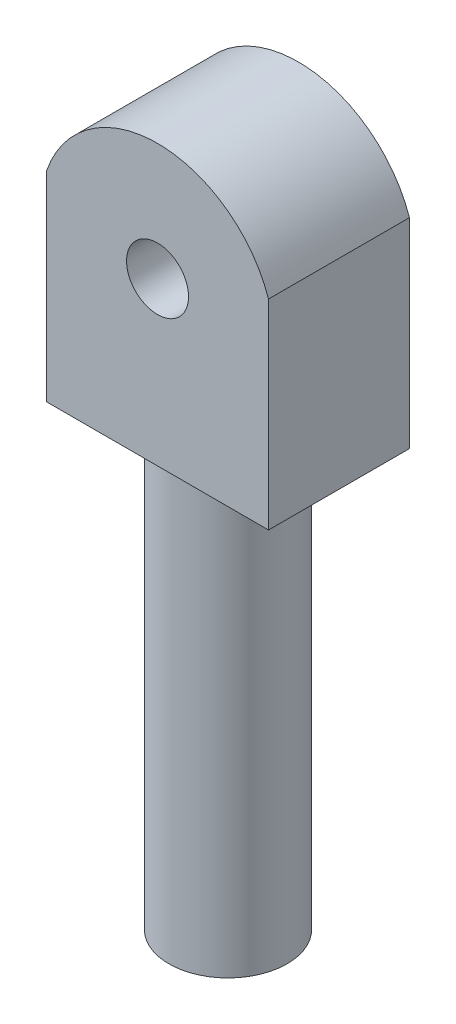
ISO-10303-21;
HEADER;
FILE_DESCRIPTION(('STEP AP214'),'2;1');
FILE_NAME('part.step','',(''),(''),'','','');
FILE_SCHEMA(('AUTOMOTIVE_DESIGN { 1 0 10303 214 1 1 1 1 }'));
ENDSEC;
DATA;
#1=APPLICATION_CONTEXT('core data for automotive mechanical design processes');
#2=APPLICATION_PROTOCOL_DEFINITION('international standard','automotive_design',2000,#1);
#3=PRODUCT_CONTEXT('',#1,'mechanical');
#4=PRODUCT('Part','Part','',(#3));
#5=PRODUCT_RELATED_PRODUCT_CATEGORY('part','',(#4));
#6=PRODUCT_DEFINITION_FORMATION('','',#4);
#7=PRODUCT_DEFINITION_CONTEXT('part definition',#1,'design');
#8=PRODUCT_DEFINITION('design','',#6,#7);
#9=PRODUCT_DEFINITION_SHAPE('','',#8);
#10=(LENGTH_UNIT() NAMED_UNIT(*) SI_UNIT(.MILLI.,.METRE.));
#11=(NAMED_UNIT(*) PLANE_ANGLE_UNIT() SI_UNIT($,.RADIAN.));
#12=(NAMED_UNIT(*) SI_UNIT($,.STERADIAN.) SOLID_ANGLE_UNIT());
#13=UNCERTAINTY_MEASURE_WITH_UNIT(LENGTH_MEASURE(1.E-05),#10,'distance_accuracy_value','');
#14=(GEOMETRIC_REPRESENTATION_CONTEXT(3) GLOBAL_UNCERTAINTY_ASSIGNED_CONTEXT((#13)) GLOBAL_UNIT_ASSIGNED_CONTEXT((#10,
#11,#12)) REPRESENTATION_CONTEXT('',''));
#15=CARTESIAN_POINT('',(0.,0.,0.));
#16=DIRECTION('',(0.,0.,1.));
#17=DIRECTION('',(1.,0.,0.));
#18=AXIS2_PLACEMENT_3D('',#15,#16,#17);
#19=CARTESIAN_POINT('',(0.,-21.59,5.08));
#20=DIRECTION('',(0.,1.,0.));
#21=DIRECTION('',(0.,0.,1.));
#22=AXIS2_PLACEMENT_3D('',#19,#20,#21);
#23=PLANE('',#22);
#24=CARTESIAN_POINT('',(0.,-21.59,2.54));
#25=DIRECTION('',(0.,-1.,0.));
#26=DIRECTION('',(0.,0.,-1.));
#27=AXIS2_PLACEMENT_3D('',#24,#25,#26);
#28=CIRCLE('',#27,1.0922);
#29=CARTESIAN_POINT('',(0.,-21.59,1.4478));
#30=VERTEX_POINT('',#29);
#31=EDGE_CURVE('E102',#30,#30,#28,.T.);
#32=ORIENTED_EDGE('',*,*,#31,.F.);
#33=EDGE_LOOP('',(#32));
#34=FACE_BOUND('',#33,.T.);
#35=CARTESIAN_POINT('',(0.,-21.59,2.54));
#36=DIRECTION('',(0.,-1.,0.));
#37=DIRECTION('',(0.,0.,-1.));
#38=AXIS2_PLACEMENT_3D('',#35,#36,#37);
#39=CIRCLE('',#38,2.13178571428581);
#40=CARTESIAN_POINT('',(0.,-21.59,0.408214285714195));
#41=VERTEX_POINT('',#40);
#42=EDGE_CURVE('E108',#41,#41,#39,.T.);
#43=ORIENTED_EDGE('',*,*,#42,.T.);
#44=EDGE_LOOP('',(#43));
#45=FACE_BOUND('',#44,.T.);
#46=ADVANCED_FACE('F35',(#34,#45),#23,.F.);
#47=CARTESIAN_POINT('',(0.,-5.842,2.54));
#48=DIRECTION('',(0.,-1.,0.));
#49=DIRECTION('',(0.,0.,-1.));
#50=AXIS2_PLACEMENT_3D('',#47,#48,#49);
#51=CYLINDRICAL_SURFACE('',#50,1.0922);
#52=CARTESIAN_POINT('',(0.,-5.842,2.54));
#53=DIRECTION('',(0.,-1.,0.));
#54=DIRECTION('',(0.,0.,-1.));
#55=AXIS2_PLACEMENT_3D('',#52,#53,#54);
#56=CIRCLE('',#55,1.0922);
#57=CARTESIAN_POINT('',(0.,-5.842,1.4478));
#58=VERTEX_POINT('',#57);
#59=EDGE_CURVE('E95',#58,#58,#56,.T.);
#60=ORIENTED_EDGE('',*,*,#59,.F.);
#61=EDGE_LOOP('',(#60));
#62=FACE_BOUND('',#61,.T.);
#63=ORIENTED_EDGE('',*,*,#31,.T.);
#64=EDGE_LOOP('',(#63));
#65=FACE_BOUND('',#64,.T.);
#66=ADVANCED_FACE('F136',(#62,#65),#51,.F.);
#67=CARTESIAN_POINT('',(0.,-5.842,2.54));
#68=DIRECTION('',(0.,-1.,0.));
#69=DIRECTION('',(0.,0.,-1.));
#70=AXIS2_PLACEMENT_3D('',#67,#68,#69);
#71=PLANE('',#70);
#72=ORIENTED_EDGE('',*,*,#59,.T.);
#73=EDGE_LOOP('',(#72));
#74=FACE_BOUND('',#73,.T.);
#75=ADVANCED_FACE('F133',(#74),#71,.T.);
#76=CARTESIAN_POINT('',(0.,-5.842,2.54));
#77=DIRECTION('',(0.,-1.,0.));
#78=DIRECTION('',(0.,0.,-1.));
#79=AXIS2_PLACEMENT_3D('',#76,#77,#78);
#80=CYLINDRICAL_SURFACE('',#79,2.13178571428581);
#81=CARTESIAN_POINT('',(0.,-5.842,2.54));
#82=DIRECTION('',(0.,-1.,0.));
#83=DIRECTION('',(0.,0.,-1.));
#84=AXIS2_PLACEMENT_3D('',#81,#82,#83);
#85=CIRCLE('',#84,2.13178571428581);
#86=CARTESIAN_POINT('',(0.,-5.842,0.408214285714195));
#87=VERTEX_POINT('',#86);
#88=EDGE_CURVE('E111',#87,#87,#85,.T.);
#89=ORIENTED_EDGE('',*,*,#88,.T.);
#90=EDGE_LOOP('',(#89));
#91=FACE_BOUND('',#90,.T.);
#92=ORIENTED_EDGE('',*,*,#42,.F.);
#93=EDGE_LOOP('',(#92));
#94=FACE_BOUND('',#93,.T.);
#95=ADVANCED_FACE('F121',(#91,#94),#80,.T.);
#96=CARTESIAN_POINT('',(0.,-5.842,0.));
#97=DIRECTION('',(0.,-1.,0.));
#98=DIRECTION('',(0.,0.,-1.));
#99=AXIS2_PLACEMENT_3D('',#96,#97,#98);
#100=PLANE('',#99);
#101=ORIENTED_EDGE('',*,*,#88,.F.);
#102=EDGE_LOOP('',(#101));
#103=FACE_BOUND('',#102,.T.);
#104=DIRECTION('',(0.,0.,-1.));
#105=VECTOR('',#104,1.);
#106=CARTESIAN_POINT('',(-4.0005,-5.842,0.));
#107=LINE('',#106,#105);
#108=CARTESIAN_POINT('',(-4.0005,-5.842,5.08));
#109=VERTEX_POINT('',#108);
#110=CARTESIAN_POINT('',(-4.0005,-5.842,0.));
#111=VERTEX_POINT('',#110);
#112=EDGE_CURVE('E49',#109,#111,#107,.T.);
#113=ORIENTED_EDGE('',*,*,#112,.T.);
#114=DIRECTION('',(1.,0.,0.));
#115=VECTOR('',#114,1.);
#116=CARTESIAN_POINT('',(0.,-5.842,0.));
#117=LINE('',#116,#115);
#118=CARTESIAN_POINT('',(4.0005,-5.842,0.));
#119=VERTEX_POINT('',#118);
#120=EDGE_CURVE('E87',#111,#119,#117,.T.);
#121=ORIENTED_EDGE('',*,*,#120,.T.);
#122=DIRECTION('',(0.,0.,1.));
#123=VECTOR('',#122,1.);
#124=CARTESIAN_POINT('',(4.0005,-5.842,0.));
#125=LINE('',#124,#123);
#126=CARTESIAN_POINT('',(4.0005,-5.842,5.08));
#127=VERTEX_POINT('',#126);
#128=EDGE_CURVE('E113',#119,#127,#125,.T.);
#129=ORIENTED_EDGE('',*,*,#128,.T.);
#130=DIRECTION('',(-1.,0.,0.));
#131=VECTOR('',#130,1.);
#132=CARTESIAN_POINT('',(0.,-5.842,5.08));
#133=LINE('',#132,#131);
#134=EDGE_CURVE('E105',#127,#109,#133,.T.);
#135=ORIENTED_EDGE('',*,*,#134,.T.);
#136=EDGE_LOOP('',(#113,#121,#129,#135));
#137=FACE_BOUND('',#136,.T.);
#138=ADVANCED_FACE('F124',(#103,#137),#100,.T.);
#139=CARTESIAN_POINT('',(0.,0.,5.08));
#140=DIRECTION('',(0.,0.,-1.));
#141=DIRECTION('',(-1.,0.,0.));
#142=AXIS2_PLACEMENT_3D('',#139,#140,#141);
#143=CYLINDRICAL_SURFACE('',#142,4.22805031705557);
#144=CARTESIAN_POINT('',(0.,0.,0.));
#145=DIRECTION('',(0.,0.,1.));
#146=DIRECTION('',(1.,0.,0.));
#147=AXIS2_PLACEMENT_3D('',#144,#145,#146);
#148=CIRCLE('',#147,4.22805031705557);
#149=CARTESIAN_POINT('',(4.0005,1.36836005260082,0.));
#150=VERTEX_POINT('',#149);
#151=CARTESIAN_POINT('',(-4.0005,1.36836005260082,0.));
#152=VERTEX_POINT('',#151);
#153=EDGE_CURVE('E70',#150,#152,#148,.T.);
#154=ORIENTED_EDGE('',*,*,#153,.T.);
#155=DIRECTION('',(0.,0.,-1.));
#156=VECTOR('',#155,1.);
#157=CARTESIAN_POINT('',(-4.0005,1.36836005260082,5.08));
#158=LINE('',#157,#156);
#159=CARTESIAN_POINT('',(-4.0005,1.36836005260082,5.08));
#160=VERTEX_POINT('',#159);
#161=EDGE_CURVE('E42',#160,#152,#158,.T.);
#162=ORIENTED_EDGE('',*,*,#161,.F.);
#163=CARTESIAN_POINT('',(0.,0.,5.08));
#164=DIRECTION('',(0.,0.,1.));
#165=DIRECTION('',(1.,0.,0.));
#166=AXIS2_PLACEMENT_3D('',#163,#164,#165);
#167=CIRCLE('',#166,4.22805031705557);
#168=CARTESIAN_POINT('',(4.0005,1.36836005260082,5.08));
#169=VERTEX_POINT('',#168);
#170=EDGE_CURVE('E58',#169,#160,#167,.T.);
#171=ORIENTED_EDGE('',*,*,#170,.F.);
#172=DIRECTION('',(0.,0.,-1.));
#173=VECTOR('',#172,1.);
#174=CARTESIAN_POINT('',(4.0005,1.36836005260082,5.08));
#175=LINE('',#174,#173);
#176=EDGE_CURVE('E11',#169,#150,#175,.T.);
#177=ORIENTED_EDGE('',*,*,#176,.T.);
#178=EDGE_LOOP('',(#154,#162,#171,#177));
#179=FACE_BOUND('',#178,.T.);
#180=ADVANCED_FACE('F72',(#179),#143,.T.);
#181=CARTESIAN_POINT('',(0.,0.,5.08));
#182=DIRECTION('',(0.,0.,-1.));
#183=DIRECTION('',(-1.,0.,0.));
#184=AXIS2_PLACEMENT_3D('',#181,#182,#183);
#185=CYLINDRICAL_SURFACE('',#184,1.1176);
#186=CARTESIAN_POINT('',(0.,0.,5.08));
#187=DIRECTION('',(0.,0.,1.));
#188=DIRECTION('',(1.,0.,0.));
#189=AXIS2_PLACEMENT_3D('',#186,#187,#188);
#190=CIRCLE('',#189,1.1176);
#191=CARTESIAN_POINT('',(1.1176,0.,5.08));
#192=VERTEX_POINT('',#191);
#193=EDGE_CURVE('E85',#192,#192,#190,.T.);
#194=ORIENTED_EDGE('',*,*,#193,.T.);
#195=EDGE_LOOP('',(#194));
#196=FACE_BOUND('',#195,.T.);
#197=CARTESIAN_POINT('',(0.,0.,0.));
#198=DIRECTION('',(0.,0.,1.));
#199=DIRECTION('',(1.,0.,0.));
#200=AXIS2_PLACEMENT_3D('',#197,#198,#199);
#201=CIRCLE('',#200,1.1176);
#202=CARTESIAN_POINT('',(1.1176,0.,0.));
#203=VERTEX_POINT('',#202);
#204=EDGE_CURVE('E88',#203,#203,#201,.T.);
#205=ORIENTED_EDGE('',*,*,#204,.F.);
#206=EDGE_LOOP('',(#205));
#207=FACE_BOUND('',#206,.T.);
#208=ADVANCED_FACE('F131',(#196,#207),#185,.F.);
#209=CARTESIAN_POINT('',(0.,0.,0.));
#210=DIRECTION('',(0.,0.,1.));
#211=DIRECTION('',(1.,0.,0.));
#212=AXIS2_PLACEMENT_3D('',#209,#210,#211);
#213=PLANE('',#212);
#214=ORIENTED_EDGE('',*,*,#204,.T.);
#215=EDGE_LOOP('',(#214));
#216=FACE_BOUND('',#215,.T.);
#217=ORIENTED_EDGE('',*,*,#120,.F.);
#218=DIRECTION('',(0.,-1.,0.));
#219=VECTOR('',#218,1.);
#220=CARTESIAN_POINT('',(-4.0005,0.,0.));
#221=LINE('',#220,#219);
#222=EDGE_CURVE('E78',#152,#111,#221,.T.);
#223=ORIENTED_EDGE('',*,*,#222,.F.);
#224=ORIENTED_EDGE('',*,*,#153,.F.);
#225=DIRECTION('',(0.,-1.,0.));
#226=VECTOR('',#225,1.);
#227=CARTESIAN_POINT('',(4.0005,0.,0.));
#228=LINE('',#227,#226);
#229=EDGE_CURVE('E79',#150,#119,#228,.T.);
#230=ORIENTED_EDGE('',*,*,#229,.T.);
#231=EDGE_LOOP('',(#217,#223,#224,#230));
#232=FACE_BOUND('',#231,.T.);
#233=ADVANCED_FACE('F86',(#216,#232),#213,.F.);
#234=CARTESIAN_POINT('',(0.,0.,5.08));
#235=DIRECTION('',(0.,0.,1.));
#236=DIRECTION('',(1.,0.,0.));
#237=AXIS2_PLACEMENT_3D('',#234,#235,#236);
#238=PLANE('',#237);
#239=ORIENTED_EDGE('',*,*,#193,.F.);
#240=EDGE_LOOP('',(#239));
#241=FACE_BOUND('',#240,.T.);
#242=DIRECTION('',(0.,-1.,0.));
#243=VECTOR('',#242,1.);
#244=CARTESIAN_POINT('',(-4.0005,0.,5.08));
#245=LINE('',#244,#243);
#246=EDGE_CURVE('E84',#160,#109,#245,.T.);
#247=ORIENTED_EDGE('',*,*,#246,.T.);
#248=ORIENTED_EDGE('',*,*,#134,.F.);
#249=DIRECTION('',(0.,-1.,0.));
#250=VECTOR('',#249,1.);
#251=CARTESIAN_POINT('',(4.0005,0.,5.08));
#252=LINE('',#251,#250);
#253=EDGE_CURVE('E91',#169,#127,#252,.T.);
#254=ORIENTED_EDGE('',*,*,#253,.F.);
#255=ORIENTED_EDGE('',*,*,#170,.T.);
#256=EDGE_LOOP('',(#247,#248,#254,#255));
#257=FACE_BOUND('',#256,.T.);
#258=ADVANCED_FACE('F154',(#241,#257),#238,.T.);
#259=CARTESIAN_POINT('',(-4.0005,0.,5.08));
#260=DIRECTION('',(1.,0.,0.));
#261=DIRECTION('',(0.,1.,0.));
#262=AXIS2_PLACEMENT_3D('',#259,#260,#261);
#263=PLANE('',#262);
#264=ORIENTED_EDGE('',*,*,#112,.F.);
#265=ORIENTED_EDGE('',*,*,#246,.F.);
#266=ORIENTED_EDGE('',*,*,#161,.T.);
#267=ORIENTED_EDGE('',*,*,#222,.T.);
#268=EDGE_LOOP('',(#264,#265,#266,#267));
#269=FACE_BOUND('',#268,.T.);
#270=ADVANCED_FACE('F83',(#269),#263,.F.);
#271=CARTESIAN_POINT('',(4.0005,0.,5.08));
#272=DIRECTION('',(1.,0.,0.));
#273=DIRECTION('',(0.,1.,0.));
#274=AXIS2_PLACEMENT_3D('',#271,#272,#273);
#275=PLANE('',#274);
#276=ORIENTED_EDGE('',*,*,#253,.T.);
#277=ORIENTED_EDGE('',*,*,#128,.F.);
#278=ORIENTED_EDGE('',*,*,#229,.F.);
#279=ORIENTED_EDGE('',*,*,#176,.F.);
#280=EDGE_LOOP('',(#276,#277,#278,#279));
#281=FACE_BOUND('',#280,.T.);
#282=ADVANCED_FACE('F165',(#281),#275,.T.);
#283=CLOSED_SHELL('',(#46,#66,#75,#95,#138,#180,#208,#233,#258,#270,#282));
#284=MANIFOLD_SOLID_BREP('B2',#283);
#285=ADVANCED_BREP_SHAPE_REPRESENTATION('',(#18,#284),#14);
#286=SHAPE_DEFINITION_REPRESENTATION(#9,#285);
ENDSEC;
END-ISO-10303-21;
